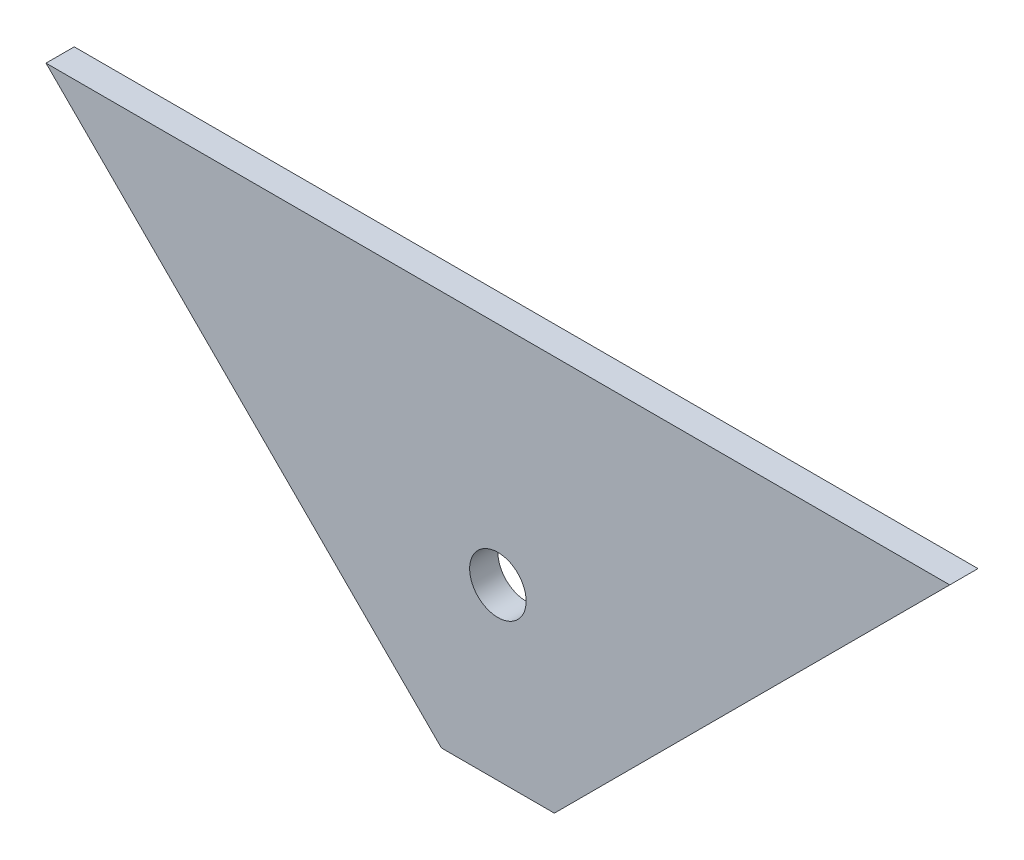
ISO-10303-21;
HEADER;
FILE_DESCRIPTION(('STEP AP214'),'2;1');
FILE_NAME('part.step','',(''),(''),'','','');
FILE_SCHEMA(('AUTOMOTIVE_DESIGN { 1 0 10303 214 1 1 1 1 }'));
ENDSEC;
DATA;
#1=APPLICATION_CONTEXT('core data for automotive mechanical design processes');
#2=APPLICATION_PROTOCOL_DEFINITION('international standard','automotive_design',2000,#1);
#3=PRODUCT_CONTEXT('',#1,'mechanical');
#4=PRODUCT('Part','Part','',(#3));
#5=PRODUCT_RELATED_PRODUCT_CATEGORY('part','',(#4));
#6=PRODUCT_DEFINITION_FORMATION('','',#4);
#7=PRODUCT_DEFINITION_CONTEXT('part definition',#1,'design');
#8=PRODUCT_DEFINITION('design','',#6,#7);
#9=PRODUCT_DEFINITION_SHAPE('','',#8);
#10=(LENGTH_UNIT() NAMED_UNIT(*) SI_UNIT(.MILLI.,.METRE.));
#11=(NAMED_UNIT(*) PLANE_ANGLE_UNIT() SI_UNIT($,.RADIAN.));
#12=(NAMED_UNIT(*) SI_UNIT($,.STERADIAN.) SOLID_ANGLE_UNIT());
#13=UNCERTAINTY_MEASURE_WITH_UNIT(LENGTH_MEASURE(1.E-05),#10,'distance_accuracy_value','');
#14=(GEOMETRIC_REPRESENTATION_CONTEXT(3) GLOBAL_UNCERTAINTY_ASSIGNED_CONTEXT((#13)) GLOBAL_UNIT_ASSIGNED_CONTEXT((#10,
#11,#12)) REPRESENTATION_CONTEXT('',''));
#15=CARTESIAN_POINT('',(0.,0.,0.));
#16=DIRECTION('',(0.,0.,1.));
#17=DIRECTION('',(1.,0.,0.));
#18=AXIS2_PLACEMENT_3D('',#15,#16,#17);
#19=CARTESIAN_POINT('',(101.600000000001,0.,3.175));
#20=DIRECTION('',(0.,-1.,0.));
#21=DIRECTION('',(1.,0.,0.));
#22=AXIS2_PLACEMENT_3D('',#19,#20,#21);
#23=PLANE('',#22);
#24=DIRECTION('',(-1.,0.,0.));
#25=VECTOR('',#24,1.);
#26=CARTESIAN_POINT('',(101.600000000001,0.,-3.175));
#27=LINE('',#26,#25);
#28=CARTESIAN_POINT('',(101.600000000001,0.,-3.175));
#29=VERTEX_POINT('',#28);
#30=CARTESIAN_POINT('',(-101.600000000001,0.,-3.175));
#31=VERTEX_POINT('',#30);
#32=EDGE_CURVE('E107',#29,#31,#27,.T.);
#33=ORIENTED_EDGE('',*,*,#32,.T.);
#34=DIRECTION('',(0.,0.,-1.));
#35=VECTOR('',#34,1.);
#36=CARTESIAN_POINT('',(-101.600000000001,0.,3.175));
#37=LINE('',#36,#35);
#38=CARTESIAN_POINT('',(-101.600000000001,0.,3.175));
#39=VERTEX_POINT('',#38);
#40=EDGE_CURVE('E11',#39,#31,#37,.T.);
#41=ORIENTED_EDGE('',*,*,#40,.F.);
#42=DIRECTION('',(-1.,0.,0.));
#43=VECTOR('',#42,1.);
#44=CARTESIAN_POINT('',(101.600000000001,0.,3.175));
#45=LINE('',#44,#43);
#46=CARTESIAN_POINT('',(101.600000000001,0.,3.175));
#47=VERTEX_POINT('',#46);
#48=EDGE_CURVE('E91',#47,#39,#45,.T.);
#49=ORIENTED_EDGE('',*,*,#48,.F.);
#50=DIRECTION('',(0.,0.,-1.));
#51=VECTOR('',#50,1.);
#52=CARTESIAN_POINT('',(101.600000000001,0.,3.175));
#53=LINE('',#52,#51);
#54=EDGE_CURVE('E103',#47,#29,#53,.T.);
#55=ORIENTED_EDGE('',*,*,#54,.T.);
#56=EDGE_LOOP('',(#33,#41,#49,#55));
#57=FACE_BOUND('',#56,.T.);
#58=ADVANCED_FACE('F39',(#57),#23,.F.);
#59=CARTESIAN_POINT('',(-101.600000000001,0.,3.175));
#60=DIRECTION('',(0.707106781186543,0.707106781186552,0.));
#61=DIRECTION('',(-0.707106781186552,0.707106781186543,0.));
#62=AXIS2_PLACEMENT_3D('',#59,#60,#61);
#63=PLANE('',#62);
#64=DIRECTION('',(0.707106781186552,-0.707106781186543,0.));
#65=VECTOR('',#64,1.);
#66=CARTESIAN_POINT('',(-101.600000000001,0.,-3.175));
#67=LINE('',#66,#65);
#68=CARTESIAN_POINT('',(-12.7,-88.9000000000001,-3.175));
#69=VERTEX_POINT('',#68);
#70=EDGE_CURVE('E96',#31,#69,#67,.T.);
#71=ORIENTED_EDGE('',*,*,#70,.T.);
#72=DIRECTION('',(0.,0.,-1.));
#73=VECTOR('',#72,1.);
#74=CARTESIAN_POINT('',(-12.7,-88.9000000000001,3.175));
#75=LINE('',#74,#73);
#76=CARTESIAN_POINT('',(-12.7,-88.9000000000001,3.175));
#77=VERTEX_POINT('',#76);
#78=EDGE_CURVE('E48',#77,#69,#75,.T.);
#79=ORIENTED_EDGE('',*,*,#78,.F.);
#80=DIRECTION('',(0.707106781186552,-0.707106781186543,0.));
#81=VECTOR('',#80,1.);
#82=CARTESIAN_POINT('',(-101.600000000001,0.,3.175));
#83=LINE('',#82,#81);
#84=EDGE_CURVE('E86',#39,#77,#83,.T.);
#85=ORIENTED_EDGE('',*,*,#84,.F.);
#86=ORIENTED_EDGE('',*,*,#40,.T.);
#87=EDGE_LOOP('',(#71,#79,#85,#86));
#88=FACE_BOUND('',#87,.T.);
#89=ADVANCED_FACE('F95',(#88),#63,.F.);
#90=CARTESIAN_POINT('',(-12.7,-88.9000000000001,3.175));
#91=DIRECTION('',(0.,1.,0.));
#92=DIRECTION('',(-1.,0.,0.));
#93=AXIS2_PLACEMENT_3D('',#90,#91,#92);
#94=PLANE('',#93);
#95=DIRECTION('',(1.,0.,0.));
#96=VECTOR('',#95,1.);
#97=CARTESIAN_POINT('',(-12.7,-88.9000000000001,-3.175));
#98=LINE('',#97,#96);
#99=CARTESIAN_POINT('',(12.7,-88.9000000000001,-3.175));
#100=VERTEX_POINT('',#99);
#101=EDGE_CURVE('E73',#69,#100,#98,.T.);
#102=ORIENTED_EDGE('',*,*,#101,.T.);
#103=DIRECTION('',(0.,0.,-1.));
#104=VECTOR('',#103,1.);
#105=CARTESIAN_POINT('',(12.7,-88.9000000000001,3.175));
#106=LINE('',#105,#104);
#107=CARTESIAN_POINT('',(12.7,-88.9000000000001,3.175));
#108=VERTEX_POINT('',#107);
#109=EDGE_CURVE('E98',#108,#100,#106,.T.);
#110=ORIENTED_EDGE('',*,*,#109,.F.);
#111=DIRECTION('',(1.,0.,0.));
#112=VECTOR('',#111,1.);
#113=CARTESIAN_POINT('',(-12.7,-88.9000000000001,3.175));
#114=LINE('',#113,#112);
#115=EDGE_CURVE('E89',#77,#108,#114,.T.);
#116=ORIENTED_EDGE('',*,*,#115,.F.);
#117=ORIENTED_EDGE('',*,*,#78,.T.);
#118=EDGE_LOOP('',(#102,#110,#116,#117));
#119=FACE_BOUND('',#118,.T.);
#120=ADVANCED_FACE('F99',(#119),#94,.F.);
#121=CARTESIAN_POINT('',(12.7,-88.9000000000001,3.175));
#122=DIRECTION('',(-0.707106781186544,0.707106781186551,0.));
#123=DIRECTION('',(-0.707106781186551,-0.707106781186544,0.));
#124=AXIS2_PLACEMENT_3D('',#121,#122,#123);
#125=PLANE('',#124);
#126=DIRECTION('',(0.707106781186551,0.707106781186544,0.));
#127=VECTOR('',#126,1.);
#128=CARTESIAN_POINT('',(12.7,-88.9000000000001,-3.175));
#129=LINE('',#128,#127);
#130=EDGE_CURVE('E79',#100,#29,#129,.T.);
#131=ORIENTED_EDGE('',*,*,#130,.T.);
#132=ORIENTED_EDGE('',*,*,#54,.F.);
#133=DIRECTION('',(0.707106781186551,0.707106781186544,0.));
#134=VECTOR('',#133,1.);
#135=CARTESIAN_POINT('',(12.7,-88.9000000000001,3.175));
#136=LINE('',#135,#134);
#137=EDGE_CURVE('E56',#108,#47,#136,.T.);
#138=ORIENTED_EDGE('',*,*,#137,.F.);
#139=ORIENTED_EDGE('',*,*,#109,.T.);
#140=EDGE_LOOP('',(#131,#132,#138,#139));
#141=FACE_BOUND('',#140,.T.);
#142=ADVANCED_FACE('F121',(#141),#125,.F.);
#143=CARTESIAN_POINT('',(0.,0.,3.175));
#144=DIRECTION('',(0.,0.,1.));
#145=DIRECTION('',(1.,0.,0.));
#146=AXIS2_PLACEMENT_3D('',#143,#144,#145);
#147=PLANE('',#146);
#148=CARTESIAN_POINT('',(0.,-50.8,3.175));
#149=DIRECTION('',(0.,0.,1.));
#150=DIRECTION('',(1.,0.,0.));
#151=AXIS2_PLACEMENT_3D('',#148,#149,#150);
#152=CIRCLE('',#151,6.35);
#153=CARTESIAN_POINT('',(6.34999999999999,-50.8,3.175));
#154=VERTEX_POINT('',#153);
#155=EDGE_CURVE('E128',#154,#154,#152,.T.);
#156=ORIENTED_EDGE('',*,*,#155,.F.);
#157=EDGE_LOOP('',(#156));
#158=FACE_BOUND('',#157,.T.);
#159=ORIENTED_EDGE('',*,*,#48,.T.);
#160=ORIENTED_EDGE('',*,*,#84,.T.);
#161=ORIENTED_EDGE('',*,*,#115,.T.);
#162=ORIENTED_EDGE('',*,*,#137,.T.);
#163=EDGE_LOOP('',(#159,#160,#161,#162));
#164=FACE_BOUND('',#163,.T.);
#165=ADVANCED_FACE('F87',(#158,#164),#147,.T.);
#166=CARTESIAN_POINT('',(0.,0.,-3.175));
#167=DIRECTION('',(0.,0.,1.));
#168=DIRECTION('',(1.,0.,0.));
#169=AXIS2_PLACEMENT_3D('',#166,#167,#168);
#170=PLANE('',#169);
#171=CARTESIAN_POINT('',(0.,-50.8,-3.175));
#172=DIRECTION('',(0.,0.,1.));
#173=DIRECTION('',(1.,0.,0.));
#174=AXIS2_PLACEMENT_3D('',#171,#172,#173);
#175=CIRCLE('',#174,6.35);
#176=CARTESIAN_POINT('',(6.34999999999999,-50.8,-3.175));
#177=VERTEX_POINT('',#176);
#178=EDGE_CURVE('E111',#177,#177,#175,.T.);
#179=ORIENTED_EDGE('',*,*,#178,.T.);
#180=EDGE_LOOP('',(#179));
#181=FACE_BOUND('',#180,.T.);
#182=ORIENTED_EDGE('',*,*,#32,.F.);
#183=ORIENTED_EDGE('',*,*,#130,.F.);
#184=ORIENTED_EDGE('',*,*,#101,.F.);
#185=ORIENTED_EDGE('',*,*,#70,.F.);
#186=EDGE_LOOP('',(#182,#183,#184,#185));
#187=FACE_BOUND('',#186,.T.);
#188=ADVANCED_FACE('F124',(#181,#187),#170,.F.);
#189=CARTESIAN_POINT('',(0.,-50.8,-3.175));
#190=DIRECTION('',(0.,0.,1.));
#191=DIRECTION('',(1.,0.,0.));
#192=AXIS2_PLACEMENT_3D('',#189,#190,#191);
#193=CYLINDRICAL_SURFACE('',#192,6.35);
#194=ORIENTED_EDGE('',*,*,#178,.F.);
#195=EDGE_LOOP('',(#194));
#196=FACE_BOUND('',#195,.T.);
#197=ORIENTED_EDGE('',*,*,#155,.T.);
#198=EDGE_LOOP('',(#197));
#199=FACE_BOUND('',#198,.T.);
#200=ADVANCED_FACE('F137',(#196,#199),#193,.F.);
#201=CLOSED_SHELL('',(#58,#89,#120,#142,#165,#188,#200));
#202=MANIFOLD_SOLID_BREP('B2',#201);
#203=ADVANCED_BREP_SHAPE_REPRESENTATION('',(#18,#202),#14);
#204=SHAPE_DEFINITION_REPRESENTATION(#9,#203);
ENDSEC;
END-ISO-10303-21;
